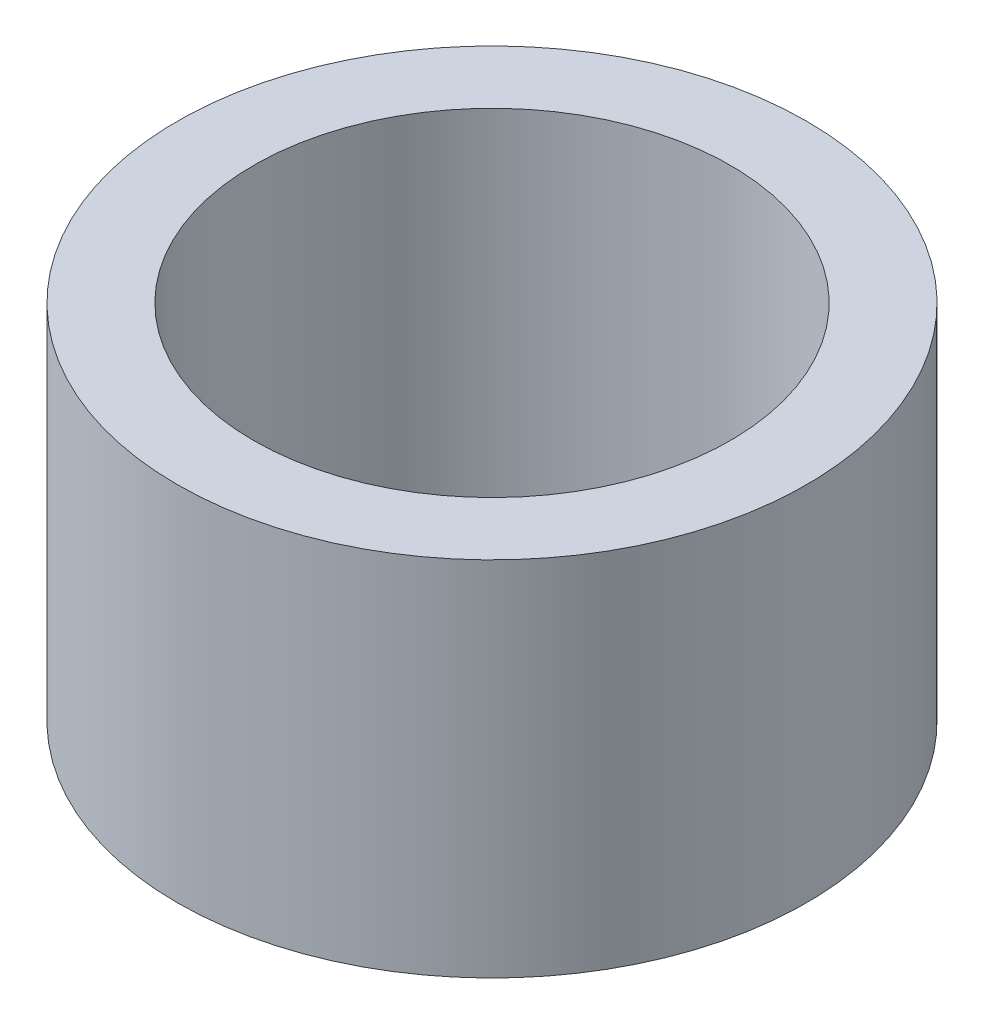
ISO-10303-21;
HEADER;
FILE_DESCRIPTION(('STEP AP214'),'2;1');
FILE_NAME('part.step','',(''),(''),'','','');
FILE_SCHEMA(('AUTOMOTIVE_DESIGN { 1 0 10303 214 1 1 1 1 }'));
ENDSEC;
DATA;
#1=APPLICATION_CONTEXT('core data for automotive mechanical design processes');
#2=APPLICATION_PROTOCOL_DEFINITION('international standard','automotive_design',2000,#1);
#3=PRODUCT_CONTEXT('',#1,'mechanical');
#4=PRODUCT('Part','Part','',(#3));
#5=PRODUCT_RELATED_PRODUCT_CATEGORY('part','',(#4));
#6=PRODUCT_DEFINITION_FORMATION('','',#4);
#7=PRODUCT_DEFINITION_CONTEXT('part definition',#1,'design');
#8=PRODUCT_DEFINITION('design','',#6,#7);
#9=PRODUCT_DEFINITION_SHAPE('','',#8);
#10=(LENGTH_UNIT() NAMED_UNIT(*) SI_UNIT(.MILLI.,.METRE.));
#11=(NAMED_UNIT(*) PLANE_ANGLE_UNIT() SI_UNIT($,.RADIAN.));
#12=(NAMED_UNIT(*) SI_UNIT($,.STERADIAN.) SOLID_ANGLE_UNIT());
#13=UNCERTAINTY_MEASURE_WITH_UNIT(LENGTH_MEASURE(1.E-05),#10,'distance_accuracy_value','');
#14=(GEOMETRIC_REPRESENTATION_CONTEXT(3) GLOBAL_UNCERTAINTY_ASSIGNED_CONTEXT((#13)) GLOBAL_UNIT_ASSIGNED_CONTEXT((#10,
#11,#12)) REPRESENTATION_CONTEXT('',''));
#15=CARTESIAN_POINT('',(0.,0.,0.));
#16=DIRECTION('',(0.,0.,1.));
#17=DIRECTION('',(1.,0.,0.));
#18=AXIS2_PLACEMENT_3D('',#15,#16,#17);
#19=CARTESIAN_POINT('',(0.,21.336,0.));
#20=DIRECTION('',(0.,1.,0.));
#21=DIRECTION('',(0.,0.,1.));
#22=AXIS2_PLACEMENT_3D('',#19,#20,#21);
#23=PLANE('',#22);
#24=CARTESIAN_POINT('',(0.,21.336,0.));
#25=DIRECTION('',(0.,1.,0.));
#26=DIRECTION('',(0.,0.,1.));
#27=AXIS2_PLACEMENT_3D('',#24,#25,#26);
#28=CIRCLE('',#27,18.542);
#29=CARTESIAN_POINT('',(0.,21.336,18.542));
#30=VERTEX_POINT('',#29);
#31=EDGE_CURVE('E10',#30,#30,#28,.T.);
#32=ORIENTED_EDGE('',*,*,#31,.T.);
#33=EDGE_LOOP('',(#32));
#34=FACE_BOUND('',#33,.T.);
#35=CARTESIAN_POINT('',(0.,21.336,0.));
#36=DIRECTION('',(0.,1.,0.));
#37=DIRECTION('',(0.,0.,1.));
#38=AXIS2_PLACEMENT_3D('',#35,#36,#37);
#39=CIRCLE('',#38,14.0462);
#40=CARTESIAN_POINT('',(0.,21.336,14.0462));
#41=VERTEX_POINT('',#40);
#42=EDGE_CURVE('E50',#41,#41,#39,.T.);
#43=ORIENTED_EDGE('',*,*,#42,.F.);
#44=EDGE_LOOP('',(#43));
#45=FACE_BOUND('',#44,.T.);
#46=ADVANCED_FACE('F37',(#34,#45),#23,.T.);
#47=CARTESIAN_POINT('',(0.,0.,0.));
#48=DIRECTION('',(0.,1.,0.));
#49=DIRECTION('',(0.,0.,1.));
#50=AXIS2_PLACEMENT_3D('',#47,#48,#49);
#51=PLANE('',#50);
#52=CARTESIAN_POINT('',(0.,0.,0.));
#53=DIRECTION('',(0.,1.,0.));
#54=DIRECTION('',(0.,0.,1.));
#55=AXIS2_PLACEMENT_3D('',#52,#53,#54);
#56=CIRCLE('',#55,18.542);
#57=CARTESIAN_POINT('',(0.,0.,18.542));
#58=VERTEX_POINT('',#57);
#59=EDGE_CURVE('E41',#58,#58,#56,.T.);
#60=ORIENTED_EDGE('',*,*,#59,.F.);
#61=EDGE_LOOP('',(#60));
#62=FACE_BOUND('',#61,.T.);
#63=CARTESIAN_POINT('',(0.,0.,0.));
#64=DIRECTION('',(0.,1.,0.));
#65=DIRECTION('',(0.,0.,1.));
#66=AXIS2_PLACEMENT_3D('',#63,#64,#65);
#67=CIRCLE('',#66,14.0462);
#68=CARTESIAN_POINT('',(0.,0.,14.0462));
#69=VERTEX_POINT('',#68);
#70=EDGE_CURVE('E52',#69,#69,#67,.T.);
#71=ORIENTED_EDGE('',*,*,#70,.T.);
#72=EDGE_LOOP('',(#71));
#73=FACE_BOUND('',#72,.T.);
#74=ADVANCED_FACE('F64',(#62,#73),#51,.F.);
#75=CARTESIAN_POINT('',(0.,21.336,0.));
#76=DIRECTION('',(0.,-1.,0.));
#77=DIRECTION('',(0.,0.,-1.));
#78=AXIS2_PLACEMENT_3D('',#75,#76,#77);
#79=CYLINDRICAL_SURFACE('',#78,18.542);
#80=ORIENTED_EDGE('',*,*,#31,.F.);
#81=EDGE_LOOP('',(#80));
#82=FACE_BOUND('',#81,.T.);
#83=ORIENTED_EDGE('',*,*,#59,.T.);
#84=EDGE_LOOP('',(#83));
#85=FACE_BOUND('',#84,.T.);
#86=ADVANCED_FACE('F39',(#82,#85),#79,.T.);
#87=CARTESIAN_POINT('',(0.,21.336,0.));
#88=DIRECTION('',(0.,-1.,0.));
#89=DIRECTION('',(0.,0.,-1.));
#90=AXIS2_PLACEMENT_3D('',#87,#88,#89);
#91=CYLINDRICAL_SURFACE('',#90,14.0462);
#92=ORIENTED_EDGE('',*,*,#42,.T.);
#93=EDGE_LOOP('',(#92));
#94=FACE_BOUND('',#93,.T.);
#95=ORIENTED_EDGE('',*,*,#70,.F.);
#96=EDGE_LOOP('',(#95));
#97=FACE_BOUND('',#96,.T.);
#98=ADVANCED_FACE('F60',(#94,#97),#91,.F.);
#99=CLOSED_SHELL('',(#46,#74,#86,#98));
#100=MANIFOLD_SOLID_BREP('B2',#99);
#101=ADVANCED_BREP_SHAPE_REPRESENTATION('',(#18,#100),#14);
#102=SHAPE_DEFINITION_REPRESENTATION(#9,#101);
ENDSEC;
END-ISO-10303-21;
